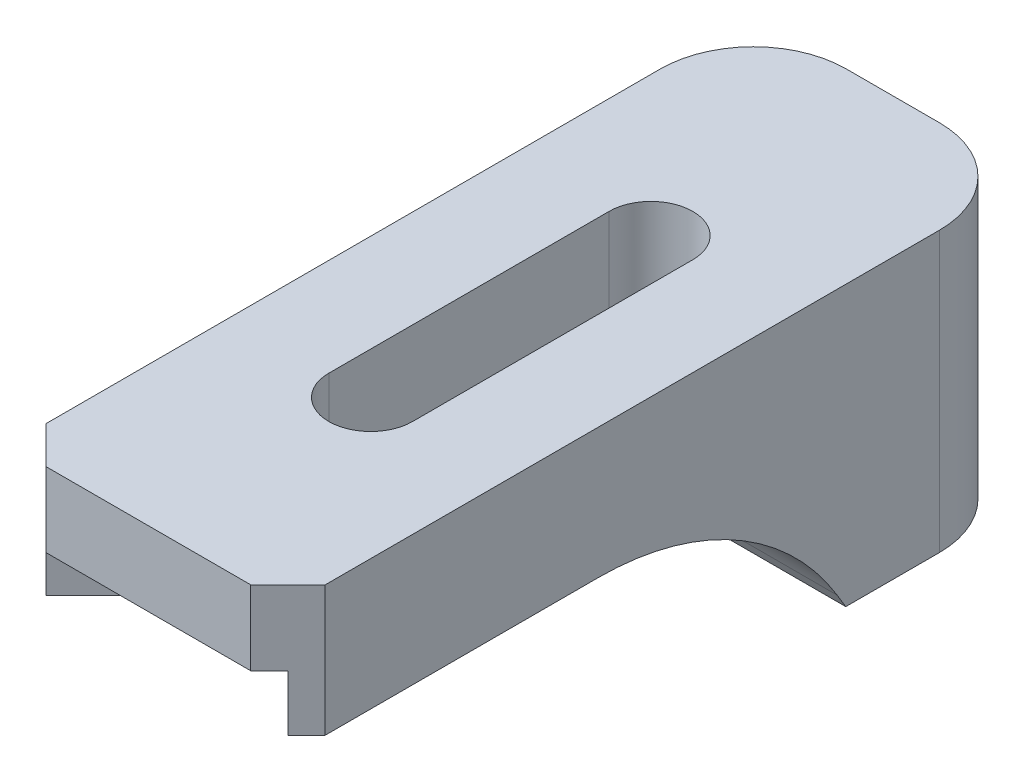
ISO-10303-21;
HEADER;
FILE_DESCRIPTION(('STEP AP214'),'2;1');
FILE_NAME('part.step','',(''),(''),'','','');
FILE_SCHEMA(('AUTOMOTIVE_DESIGN { 1 0 10303 214 1 1 1 1 }'));
ENDSEC;
DATA;
#1=APPLICATION_CONTEXT('core data for automotive mechanical design processes');
#2=APPLICATION_PROTOCOL_DEFINITION('international standard','automotive_design',2000,#1);
#3=PRODUCT_CONTEXT('',#1,'mechanical');
#4=PRODUCT('Part','Part','',(#3));
#5=PRODUCT_RELATED_PRODUCT_CATEGORY('part','',(#4));
#6=PRODUCT_DEFINITION_FORMATION('','',#4);
#7=PRODUCT_DEFINITION_CONTEXT('part definition',#1,'design');
#8=PRODUCT_DEFINITION('design','',#6,#7);
#9=PRODUCT_DEFINITION_SHAPE('','',#8);
#10=(LENGTH_UNIT() NAMED_UNIT(*) SI_UNIT(.MILLI.,.METRE.));
#11=(NAMED_UNIT(*) PLANE_ANGLE_UNIT() SI_UNIT($,.RADIAN.));
#12=(NAMED_UNIT(*) SI_UNIT($,.STERADIAN.) SOLID_ANGLE_UNIT());
#13=UNCERTAINTY_MEASURE_WITH_UNIT(LENGTH_MEASURE(1.E-05),#10,'distance_accuracy_value','');
#14=(GEOMETRIC_REPRESENTATION_CONTEXT(3) GLOBAL_UNCERTAINTY_ASSIGNED_CONTEXT((#13)) GLOBAL_UNIT_ASSIGNED_CONTEXT((#10,
#11,#12)) REPRESENTATION_CONTEXT('',''));
#15=CARTESIAN_POINT('',(0.,0.,0.));
#16=DIRECTION('',(0.,0.,1.));
#17=DIRECTION('',(1.,0.,0.));
#18=AXIS2_PLACEMENT_3D('',#15,#16,#17);
#19=CARTESIAN_POINT('',(-7.5,15.,20.));
#20=DIRECTION('',(0.,0.,-1.));
#21=DIRECTION('',(-1.,0.,0.));
#22=AXIS2_PLACEMENT_3D('',#19,#20,#21);
#23=PLANE('',#22);
#24=DIRECTION('',(1.,0.,0.));
#25=VECTOR('',#24,1.);
#26=CARTESIAN_POINT('',(-7.5,11.,20.));
#27=LINE('',#26,#25);
#28=CARTESIAN_POINT('',(-5.5,11.,20.));
#29=VERTEX_POINT('',#28);
#30=CARTESIAN_POINT('',(5.49999999999999,11.,20.));
#31=VERTEX_POINT('',#30);
#32=EDGE_CURVE('E220',#29,#31,#27,.T.);
#33=ORIENTED_EDGE('',*,*,#32,.T.);
#34=DIRECTION('',(0.,1.,0.));
#35=VECTOR('',#34,1.);
#36=CARTESIAN_POINT('',(5.49999999999999,15.,20.));
#37=LINE('',#36,#35);
#38=CARTESIAN_POINT('',(5.49999999999999,15.,20.));
#39=VERTEX_POINT('',#38);
#40=EDGE_CURVE('E317',#31,#39,#37,.T.);
#41=ORIENTED_EDGE('',*,*,#40,.T.);
#42=DIRECTION('',(1.,0.,0.));
#43=VECTOR('',#42,1.);
#44=CARTESIAN_POINT('',(-7.5,15.,20.));
#45=LINE('',#44,#43);
#46=CARTESIAN_POINT('',(-5.5,15.,20.));
#47=VERTEX_POINT('',#46);
#48=EDGE_CURVE('E261',#47,#39,#45,.T.);
#49=ORIENTED_EDGE('',*,*,#48,.F.);
#50=DIRECTION('',(0.,-1.,0.));
#51=VECTOR('',#50,1.);
#52=CARTESIAN_POINT('',(-5.5,15.,20.));
#53=LINE('',#52,#51);
#54=EDGE_CURVE('E314',#47,#29,#53,.T.);
#55=ORIENTED_EDGE('',*,*,#54,.T.);
#56=EDGE_LOOP('',(#33,#41,#49,#55));
#57=FACE_BOUND('',#56,.T.);
#58=ADVANCED_FACE('F35',(#57),#23,.F.);
#59=CARTESIAN_POINT('',(7.5,8.,20.));
#60=DIRECTION('',(0.,1.,0.));
#61=DIRECTION('',(0.,0.,1.));
#62=AXIS2_PLACEMENT_3D('',#59,#60,#61);
#63=PLANE('',#62);
#64=CARTESIAN_POINT('',(0.,8.,8.05646867848964));
#65=DIRECTION('',(0.,1.,0.));
#66=DIRECTION('',(0.,0.,1.));
#67=AXIS2_PLACEMENT_3D('',#64,#65,#66);
#68=CIRCLE('',#67,2.25);
#69=CARTESIAN_POINT('',(-2.25,8.,8.05646867848964));
#70=VERTEX_POINT('',#69);
#71=CARTESIAN_POINT('',(2.25,8.,8.05646867848964));
#72=VERTEX_POINT('',#71);
#73=EDGE_CURVE('E193',#70,#72,#68,.T.);
#74=ORIENTED_EDGE('',*,*,#73,.T.);
#75=DIRECTION('',(0.,0.,-1.));
#76=VECTOR('',#75,1.);
#77=CARTESIAN_POINT('',(2.25,8.,20.));
#78=LINE('',#77,#76);
#79=CARTESIAN_POINT('',(2.25,8.,3.32900300171792));
#80=VERTEX_POINT('',#79);
#81=EDGE_CURVE('E215',#72,#80,#78,.T.);
#82=ORIENTED_EDGE('',*,*,#81,.T.);
#83=DIRECTION('',(-1.,0.,0.));
#84=VECTOR('',#83,1.);
#85=CARTESIAN_POINT('',(7.5,8.,3.32900300171792));
#86=LINE('',#85,#84);
#87=CARTESIAN_POINT('',(7.5,8.,3.32900300171792));
#88=VERTEX_POINT('',#87);
#89=EDGE_CURVE('E273',#80,#88,#86,.F.);
#90=ORIENTED_EDGE('',*,*,#89,.T.);
#91=DIRECTION('',(0.,0.,-1.));
#92=VECTOR('',#91,1.);
#93=CARTESIAN_POINT('',(7.5,8.,20.));
#94=LINE('',#93,#92);
#95=CARTESIAN_POINT('',(7.5,8.,18.));
#96=VERTEX_POINT('',#95);
#97=EDGE_CURVE('E239',#96,#88,#94,.T.);
#98=ORIENTED_EDGE('',*,*,#97,.F.);
#99=DIRECTION('',(0.707106781186549,0.,-0.707106781186546));
#100=VECTOR('',#99,1.);
#101=CARTESIAN_POINT('',(7.5,8.,18.));
#102=LINE('',#101,#100);
#103=CARTESIAN_POINT('',(6.50000000000001,8.,19.));
#104=VERTEX_POINT('',#103);
#105=EDGE_CURVE('E306',#96,#104,#102,.F.);
#106=ORIENTED_EDGE('',*,*,#105,.T.);
#107=DIRECTION('',(-0.707106781186541,0.,-0.707106781186554));
#108=VECTOR('',#107,1.);
#109=CARTESIAN_POINT('',(7.5,8.,20.));
#110=LINE('',#109,#108);
#111=CARTESIAN_POINT('',(0.972988002638457,8.,13.4729880026383));
#112=VERTEX_POINT('',#111);
#113=EDGE_CURVE('E219',#104,#112,#110,.T.);
#114=ORIENTED_EDGE('',*,*,#113,.T.);
#115=CARTESIAN_POINT('',(1.32654139323173,8.,13.1194346120451));
#116=DIRECTION('',(0.,1.,0.));
#117=DIRECTION('',(0.,0.,1.));
#118=AXIS2_PLACEMENT_3D('',#115,#116,#117);
#119=CIRCLE('',#118,0.5);
#120=CARTESIAN_POINT('',(0.873499825074435,8.,12.9078847656221));
#121=VERTEX_POINT('',#120);
#122=EDGE_CURVE('E287',#112,#121,#119,.F.);
#123=ORIENTED_EDGE('',*,*,#122,.T.);
#124=CARTESIAN_POINT('',(0.,8.,12.4999999999999));
#125=DIRECTION('',(0.,-1.,0.));
#126=DIRECTION('',(0.,0.,-1.));
#127=AXIS2_PLACEMENT_3D('',#124,#125,#126);
#128=CIRCLE('',#127,0.964039380124995);
#129=CARTESIAN_POINT('',(-0.873499825074435,8.,12.9078847656221));
#130=VERTEX_POINT('',#129);
#131=EDGE_CURVE('E234',#130,#121,#128,.T.);
#132=ORIENTED_EDGE('',*,*,#131,.F.);
#133=CARTESIAN_POINT('',(-1.32654139323173,8.,13.1194346120451));
#134=DIRECTION('',(0.,1.,0.));
#135=DIRECTION('',(0.,0.,1.));
#136=AXIS2_PLACEMENT_3D('',#133,#134,#135);
#137=CIRCLE('',#136,0.5);
#138=CARTESIAN_POINT('',(-0.972988002638457,8.,13.4729880026383));
#139=VERTEX_POINT('',#138);
#140=EDGE_CURVE('E285',#130,#139,#137,.F.);
#141=ORIENTED_EDGE('',*,*,#140,.T.);
#142=DIRECTION('',(-0.707106781186541,0.,0.707106781186554));
#143=VECTOR('',#142,1.);
#144=CARTESIAN_POINT('',(-0.681678783017254,8.,13.1816787830171));
#145=LINE('',#144,#143);
#146=CARTESIAN_POINT('',(-6.5,8.,19.));
#147=VERTEX_POINT('',#146);
#148=EDGE_CURVE('E224',#139,#147,#145,.T.);
#149=ORIENTED_EDGE('',*,*,#148,.T.);
#150=DIRECTION('',(0.707106781186546,0.,0.707106781186549));
#151=VECTOR('',#150,1.);
#152=CARTESIAN_POINT('',(-5.49999999999999,8.,20.));
#153=LINE('',#152,#151);
#154=CARTESIAN_POINT('',(-7.5,8.,18.));
#155=VERTEX_POINT('',#154);
#156=EDGE_CURVE('E304',#147,#155,#153,.F.);
#157=ORIENTED_EDGE('',*,*,#156,.T.);
#158=DIRECTION('',(0.,0.,-1.));
#159=VECTOR('',#158,1.);
#160=CARTESIAN_POINT('',(-7.5,8.,20.));
#161=LINE('',#160,#159);
#162=CARTESIAN_POINT('',(-7.5,8.,3.32900300171792));
#163=VERTEX_POINT('',#162);
#164=EDGE_CURVE('E232',#155,#163,#161,.T.);
#165=ORIENTED_EDGE('',*,*,#164,.T.);
#166=CARTESIAN_POINT('',(-2.25,8.,3.32900300171792));
#167=VERTEX_POINT('',#166);
#168=EDGE_CURVE('E274',#163,#167,#86,.F.);
#169=ORIENTED_EDGE('',*,*,#168,.T.);
#170=DIRECTION('',(0.,0.,1.));
#171=VECTOR('',#170,1.);
#172=CARTESIAN_POINT('',(-2.25,8.,20.));
#173=LINE('',#172,#171);
#174=EDGE_CURVE('E58',#167,#70,#173,.T.);
#175=ORIENTED_EDGE('',*,*,#174,.T.);
#176=EDGE_LOOP('',(#74,#82,#90,#98,#106,#114,#123,#132,#141,#149,#157,#165,#169,#175));
#177=FACE_BOUND('',#176,.T.);
#178=ADVANCED_FACE('F386',(#177),#63,.F.);
#179=CARTESIAN_POINT('',(7.5,15.,20.));
#180=DIRECTION('',(-1.,0.,0.));
#181=DIRECTION('',(0.,0.,1.));
#182=AXIS2_PLACEMENT_3D('',#179,#180,#181);
#183=PLANE('',#182);
#184=DIRECTION('',(0.,0.,-1.));
#185=VECTOR('',#184,1.);
#186=CARTESIAN_POINT('',(7.5,0.,20.));
#187=LINE('',#186,#185);
#188=CARTESIAN_POINT('',(7.5,0.,-9.96820088032441));
#189=VERTEX_POINT('',#188);
#190=CARTESIAN_POINT('',(7.5,0.,-15.));
#191=VERTEX_POINT('',#190);
#192=EDGE_CURVE('E251',#189,#191,#187,.T.);
#193=ORIENTED_EDGE('',*,*,#192,.T.);
#194=DIRECTION('',(0.,-1.,0.));
#195=VECTOR('',#194,1.);
#196=CARTESIAN_POINT('',(7.5,15.,-15.));
#197=LINE('',#196,#195);
#198=CARTESIAN_POINT('',(7.5,15.,-15.));
#199=VERTEX_POINT('',#198);
#200=EDGE_CURVE('E337',#191,#199,#197,.F.);
#201=ORIENTED_EDGE('',*,*,#200,.T.);
#202=DIRECTION('',(0.,0.,-1.));
#203=VECTOR('',#202,1.);
#204=CARTESIAN_POINT('',(7.5,15.,20.));
#205=LINE('',#204,#203);
#206=CARTESIAN_POINT('',(7.5,15.,18.));
#207=VERTEX_POINT('',#206);
#208=EDGE_CURVE('E252',#207,#199,#205,.T.);
#209=ORIENTED_EDGE('',*,*,#208,.F.);
#210=DIRECTION('',(0.,-1.,0.));
#211=VECTOR('',#210,1.);
#212=CARTESIAN_POINT('',(7.5,15.,18.));
#213=LINE('',#212,#211);
#214=EDGE_CURVE('E301',#207,#96,#213,.T.);
#215=ORIENTED_EDGE('',*,*,#214,.T.);
#216=ORIENTED_EDGE('',*,*,#97,.T.);
#217=CARTESIAN_POINT('',(7.5,-7.,3.32900300171792));
#218=DIRECTION('',(-1.,0.,0.));
#219=DIRECTION('',(0.,0.,1.));
#220=AXIS2_PLACEMENT_3D('',#217,#218,#219);
#221=CIRCLE('',#220,15.);
#222=CARTESIAN_POINT('',(7.5,0.772425422968107,-9.50023715677935));
#223=VERTEX_POINT('',#222);
#224=EDGE_CURVE('E280',#88,#223,#221,.T.);
#225=ORIENTED_EDGE('',*,*,#224,.T.);
#226=DIRECTION('',(0.,-0.855282677233151,-0.518161694864541));
#227=VECTOR('',#226,1.);
#228=CARTESIAN_POINT('',(7.5,8.,-5.12150671796116));
#229=LINE('',#228,#227);
#230=EDGE_CURVE('E242',#223,#189,#229,.T.);
#231=ORIENTED_EDGE('',*,*,#230,.T.);
#232=EDGE_LOOP('',(#193,#201,#209,#215,#216,#225,#231));
#233=FACE_BOUND('',#232,.T.);
#234=ADVANCED_FACE('F389',(#233),#183,.F.);
#235=CARTESIAN_POINT('',(-7.5,15.,-20.));
#236=DIRECTION('',(0.,0.,1.));
#237=DIRECTION('',(1.,0.,0.));
#238=AXIS2_PLACEMENT_3D('',#235,#236,#237);
#239=PLANE('',#238);
#240=DIRECTION('',(-1.,0.,0.));
#241=VECTOR('',#240,1.);
#242=CARTESIAN_POINT('',(-7.5,15.,-20.));
#243=LINE('',#242,#241);
#244=CARTESIAN_POINT('',(2.5,15.,-20.));
#245=VERTEX_POINT('',#244);
#246=CARTESIAN_POINT('',(-2.5,15.,-20.));
#247=VERTEX_POINT('',#246);
#248=EDGE_CURVE('E255',#245,#247,#243,.T.);
#249=ORIENTED_EDGE('',*,*,#248,.F.);
#250=DIRECTION('',(0.,-1.,0.));
#251=VECTOR('',#250,1.);
#252=CARTESIAN_POINT('',(2.5,15.,-20.));
#253=LINE('',#252,#251);
#254=CARTESIAN_POINT('',(2.5,0.,-20.));
#255=VERTEX_POINT('',#254);
#256=EDGE_CURVE('E330',#245,#255,#253,.T.);
#257=ORIENTED_EDGE('',*,*,#256,.T.);
#258=DIRECTION('',(-1.,0.,0.));
#259=VECTOR('',#258,1.);
#260=CARTESIAN_POINT('',(-7.5,0.,-20.));
#261=LINE('',#260,#259);
#262=CARTESIAN_POINT('',(-2.5,0.,-20.));
#263=VERTEX_POINT('',#262);
#264=EDGE_CURVE('E267',#255,#263,#261,.T.);
#265=ORIENTED_EDGE('',*,*,#264,.T.);
#266=DIRECTION('',(0.,-1.,0.));
#267=VECTOR('',#266,1.);
#268=CARTESIAN_POINT('',(-2.5,15.,-20.));
#269=LINE('',#268,#267);
#270=EDGE_CURVE('E328',#263,#247,#269,.F.);
#271=ORIENTED_EDGE('',*,*,#270,.T.);
#272=EDGE_LOOP('',(#249,#257,#265,#271));
#273=FACE_BOUND('',#272,.T.);
#274=ADVANCED_FACE('F402',(#273),#239,.F.);
#275=CARTESIAN_POINT('',(-7.5,15.,20.));
#276=DIRECTION('',(1.,0.,0.));
#277=DIRECTION('',(0.,0.,-1.));
#278=AXIS2_PLACEMENT_3D('',#275,#276,#277);
#279=PLANE('',#278);
#280=DIRECTION('',(0.,0.,1.));
#281=VECTOR('',#280,1.);
#282=CARTESIAN_POINT('',(-7.5,15.,20.));
#283=LINE('',#282,#281);
#284=CARTESIAN_POINT('',(-7.5,15.,-15.));
#285=VERTEX_POINT('',#284);
#286=CARTESIAN_POINT('',(-7.5,15.,18.));
#287=VERTEX_POINT('',#286);
#288=EDGE_CURVE('E259',#285,#287,#283,.T.);
#289=ORIENTED_EDGE('',*,*,#288,.F.);
#290=DIRECTION('',(0.,-1.,0.));
#291=VECTOR('',#290,1.);
#292=CARTESIAN_POINT('',(-7.5,15.,-15.));
#293=LINE('',#292,#291);
#294=CARTESIAN_POINT('',(-7.5,0.,-15.));
#295=VERTEX_POINT('',#294);
#296=EDGE_CURVE('E343',#285,#295,#293,.T.);
#297=ORIENTED_EDGE('',*,*,#296,.T.);
#298=DIRECTION('',(0.,0.,1.));
#299=VECTOR('',#298,1.);
#300=CARTESIAN_POINT('',(-7.5,0.,20.));
#301=LINE('',#300,#299);
#302=CARTESIAN_POINT('',(-7.5,0.,-9.96820088032441));
#303=VERTEX_POINT('',#302);
#304=EDGE_CURVE('E256',#295,#303,#301,.T.);
#305=ORIENTED_EDGE('',*,*,#304,.T.);
#306=DIRECTION('',(0.,-0.855282677233151,-0.518161694864541));
#307=VECTOR('',#306,1.);
#308=CARTESIAN_POINT('',(-7.5,8.,-5.12150671796116));
#309=LINE('',#308,#307);
#310=CARTESIAN_POINT('',(-7.5,0.772425422968107,-9.50023715677935));
#311=VERTEX_POINT('',#310);
#312=EDGE_CURVE('E243',#311,#303,#309,.T.);
#313=ORIENTED_EDGE('',*,*,#312,.F.);
#314=CARTESIAN_POINT('',(-7.5,-7.,3.32900300171792));
#315=DIRECTION('',(1.,0.,0.));
#316=DIRECTION('',(0.,0.,-1.));
#317=AXIS2_PLACEMENT_3D('',#314,#315,#316);
#318=CIRCLE('',#317,15.);
#319=EDGE_CURVE('E277',#311,#163,#318,.T.);
#320=ORIENTED_EDGE('',*,*,#319,.T.);
#321=ORIENTED_EDGE('',*,*,#164,.F.);
#322=DIRECTION('',(0.,1.,0.));
#323=VECTOR('',#322,1.);
#324=CARTESIAN_POINT('',(-7.5,15.,18.));
#325=LINE('',#324,#323);
#326=EDGE_CURVE('E325',#155,#287,#325,.T.);
#327=ORIENTED_EDGE('',*,*,#326,.T.);
#328=EDGE_LOOP('',(#289,#297,#305,#313,#320,#321,#327));
#329=FACE_BOUND('',#328,.T.);
#330=ADVANCED_FACE('F393',(#329),#279,.F.);
#331=CARTESIAN_POINT('',(0.,15.,0.));
#332=DIRECTION('',(0.,-1.,0.));
#333=DIRECTION('',(0.,0.,-1.));
#334=AXIS2_PLACEMENT_3D('',#331,#332,#333);
#335=PLANE('',#334);
#336=DIRECTION('',(0.,0.,1.));
#337=VECTOR('',#336,1.);
#338=CARTESIAN_POINT('',(-2.25,15.,-7.));
#339=LINE('',#338,#337);
#340=CARTESIAN_POINT('',(-2.25,15.,-7.));
#341=VERTEX_POINT('',#340);
#342=CARTESIAN_POINT('',(-2.25,15.,8.05646867848964));
#343=VERTEX_POINT('',#342);
#344=EDGE_CURVE('E198',#341,#343,#339,.T.);
#345=ORIENTED_EDGE('',*,*,#344,.F.);
#346=CARTESIAN_POINT('',(0.,15.,-7.));
#347=DIRECTION('',(0.,1.,0.));
#348=DIRECTION('',(0.,0.,1.));
#349=AXIS2_PLACEMENT_3D('',#346,#347,#348);
#350=CIRCLE('',#349,2.25);
#351=CARTESIAN_POINT('',(2.25,15.,-7.));
#352=VERTEX_POINT('',#351);
#353=EDGE_CURVE('E50',#352,#341,#350,.T.);
#354=ORIENTED_EDGE('',*,*,#353,.F.);
#355=DIRECTION('',(0.,0.,-1.));
#356=VECTOR('',#355,1.);
#357=CARTESIAN_POINT('',(2.25,15.,8.05646867848964));
#358=LINE('',#357,#356);
#359=CARTESIAN_POINT('',(2.25,15.,8.05646867848964));
#360=VERTEX_POINT('',#359);
#361=EDGE_CURVE('E205',#360,#352,#358,.T.);
#362=ORIENTED_EDGE('',*,*,#361,.F.);
#363=CARTESIAN_POINT('',(0.,15.,8.05646867848964));
#364=DIRECTION('',(0.,1.,0.));
#365=DIRECTION('',(0.,0.,1.));
#366=AXIS2_PLACEMENT_3D('',#363,#364,#365);
#367=CIRCLE('',#366,2.25);
#368=EDGE_CURVE('E190',#343,#360,#367,.T.);
#369=ORIENTED_EDGE('',*,*,#368,.F.);
#370=EDGE_LOOP('',(#345,#354,#362,#369));
#371=FACE_BOUND('',#370,.T.);
#372=ORIENTED_EDGE('',*,*,#208,.T.);
#373=CARTESIAN_POINT('',(2.5,15.,-15.));
#374=DIRECTION('',(0.,-1.,0.));
#375=DIRECTION('',(0.,0.,-1.));
#376=AXIS2_PLACEMENT_3D('',#373,#374,#375);
#377=CIRCLE('',#376,5.);
#378=EDGE_CURVE('E341',#199,#245,#377,.F.);
#379=ORIENTED_EDGE('',*,*,#378,.T.);
#380=ORIENTED_EDGE('',*,*,#248,.T.);
#381=CARTESIAN_POINT('',(-2.5,15.,-15.));
#382=DIRECTION('',(0.,-1.,0.));
#383=DIRECTION('',(0.,0.,-1.));
#384=AXIS2_PLACEMENT_3D('',#381,#382,#383);
#385=CIRCLE('',#384,5.);
#386=EDGE_CURVE('E339',#247,#285,#385,.F.);
#387=ORIENTED_EDGE('',*,*,#386,.T.);
#388=ORIENTED_EDGE('',*,*,#288,.T.);
#389=DIRECTION('',(-0.707106781186546,0.,-0.707106781186549));
#390=VECTOR('',#389,1.);
#391=CARTESIAN_POINT('',(-5.5,15.,20.));
#392=LINE('',#391,#390);
#393=EDGE_CURVE('E319',#287,#47,#392,.F.);
#394=ORIENTED_EDGE('',*,*,#393,.T.);
#395=ORIENTED_EDGE('',*,*,#48,.T.);
#396=DIRECTION('',(-0.707106781186549,0.,0.707106781186546));
#397=VECTOR('',#396,1.);
#398=CARTESIAN_POINT('',(7.5,15.,18.));
#399=LINE('',#398,#397);
#400=EDGE_CURVE('E321',#39,#207,#399,.F.);
#401=ORIENTED_EDGE('',*,*,#400,.T.);
#402=EDGE_LOOP('',(#372,#379,#380,#387,#388,#394,#395,#401));
#403=FACE_BOUND('',#402,.T.);
#404=ADVANCED_FACE('F202',(#371,#403),#335,.F.);
#405=CARTESIAN_POINT('',(0.,0.,0.));
#406=DIRECTION('',(0.,-1.,0.));
#407=DIRECTION('',(0.,0.,-1.));
#408=AXIS2_PLACEMENT_3D('',#405,#406,#407);
#409=PLANE('',#408);
#410=ORIENTED_EDGE('',*,*,#264,.F.);
#411=CARTESIAN_POINT('',(2.5,0.,-15.));
#412=DIRECTION('',(0.,-1.,0.));
#413=DIRECTION('',(0.,0.,-1.));
#414=AXIS2_PLACEMENT_3D('',#411,#412,#413);
#415=CIRCLE('',#414,5.);
#416=EDGE_CURVE('E335',#255,#191,#415,.T.);
#417=ORIENTED_EDGE('',*,*,#416,.T.);
#418=ORIENTED_EDGE('',*,*,#192,.F.);
#419=DIRECTION('',(-1.,0.,0.));
#420=VECTOR('',#419,1.);
#421=CARTESIAN_POINT('',(7.5,0.,-9.96820088032441));
#422=LINE('',#421,#420);
#423=EDGE_CURVE('E245',#189,#303,#422,.T.);
#424=ORIENTED_EDGE('',*,*,#423,.T.);
#425=ORIENTED_EDGE('',*,*,#304,.F.);
#426=CARTESIAN_POINT('',(-2.5,0.,-15.));
#427=DIRECTION('',(0.,-1.,0.));
#428=DIRECTION('',(0.,0.,-1.));
#429=AXIS2_PLACEMENT_3D('',#426,#427,#428);
#430=CIRCLE('',#429,5.);
#431=EDGE_CURVE('E333',#295,#263,#430,.T.);
#432=ORIENTED_EDGE('',*,*,#431,.T.);
#433=EDGE_LOOP('',(#410,#417,#418,#424,#425,#432));
#434=FACE_BOUND('',#433,.T.);
#435=ADVANCED_FACE('F384',(#434),#409,.T.);
#436=CARTESIAN_POINT('',(7.5,8.,-5.12150671796116));
#437=DIRECTION('',(0.,0.518161694864541,-0.855282677233151));
#438=DIRECTION('',(0.,0.855282677233151,0.518161694864541));
#439=AXIS2_PLACEMENT_3D('',#436,#437,#438);
#440=PLANE('',#439);
#441=ORIENTED_EDGE('',*,*,#230,.F.);
#442=DIRECTION('',(-1.,0.,0.));
#443=VECTOR('',#442,1.);
#444=CARTESIAN_POINT('',(-7.5,0.772425422968107,-9.50023715677935));
#445=LINE('',#444,#443);
#446=EDGE_CURVE('E264',#223,#311,#445,.T.);
#447=ORIENTED_EDGE('',*,*,#446,.T.);
#448=ORIENTED_EDGE('',*,*,#312,.T.);
#449=ORIENTED_EDGE('',*,*,#423,.F.);
#450=EDGE_LOOP('',(#441,#447,#448,#449));
#451=FACE_BOUND('',#450,.T.);
#452=ADVANCED_FACE('F381',(#451),#440,.F.);
#453=CARTESIAN_POINT('',(7.5,-7.,3.32900300171792));
#454=DIRECTION('',(1.,0.,0.));
#455=DIRECTION('',(0.,0.,-1.));
#456=AXIS2_PLACEMENT_3D('',#453,#454,#455);
#457=CYLINDRICAL_SURFACE('',#456,15.);
#458=ORIENTED_EDGE('',*,*,#89,.F.);
#459=CARTESIAN_POINT('',(2.25,-7.,3.32900300171792));
#460=DIRECTION('',(1.,0.,0.));
#461=DIRECTION('',(0.,0.,-1.));
#462=AXIS2_PLACEMENT_3D('',#459,#460,#461);
#463=CIRCLE('',#462,15.);
#464=CARTESIAN_POINT('',(2.25,3.87711804617851,-7.));
#465=VERTEX_POINT('',#464);
#466=EDGE_CURVE('E11',#80,#465,#463,.F.);
#467=ORIENTED_EDGE('',*,*,#466,.T.);
#468=CARTESIAN_POINT('',(2.25,3.87711804617851,-7.));
#469=CARTESIAN_POINT('',(2.24997138100754,3.79184323014569,-7.08981955816418));
#470=CARTESIAN_POINT('',(2.24462289722561,3.70547188034882,-7.17852780092563));
#471=CARTESIAN_POINT('',(2.22385524959282,3.5312047366583,-7.35317044906093));
#472=CARTESIAN_POINT('',(2.20843982257323,3.44330952020159,-7.43910587128437));
#473=CARTESIAN_POINT('',(2.16781983756554,3.26534321226832,-7.60891737808036));
#474=CARTESIAN_POINT('',(2.14247925590786,3.17525895090335,-7.69274683120971));
#475=CARTESIAN_POINT('',(2.08237351414777,2.99480360781103,-7.85664630118208));
#476=CARTESIAN_POINT('',(2.04760760588224,2.90443250387774,-7.93671601899282));
#477=CARTESIAN_POINT('',(1.96840991428834,2.7232651885633,-8.09345738115113));
#478=CARTESIAN_POINT('',(1.92388726612326,2.63247341250642,-8.17008832265907));
#479=CARTESIAN_POINT('',(1.82523247776864,2.45222196745135,-8.31870679742484));
#480=CARTESIAN_POINT('',(1.77109638542093,2.36276286278152,-8.39069240429343));
#481=CARTESIAN_POINT('',(1.65315215542454,2.18697558918757,-8.52898603969004));
#482=CARTESIAN_POINT('',(1.58940711775574,2.10063124262674,-8.59532698788465));
#483=CARTESIAN_POINT('',(1.45125197687365,1.93226456231607,-8.72195989472185));
#484=CARTESIAN_POINT('',(1.376856077768,1.85023666822988,-8.7822597306533));
#485=CARTESIAN_POINT('',(1.23089485945456,1.70749611157732,-8.88515989501331));
#486=CARTESIAN_POINT('',(1.16132477405498,1.64563761238657,-8.92897591260643));
#487=CARTESIAN_POINT('',(1.01335132471035,1.52863624961098,-9.01066669719225));
#488=CARTESIAN_POINT('',(0.934940470188233,1.47349916448971,-9.04853635999195));
#489=CARTESIAN_POINT('',(0.767322894499234,1.37251307553087,-9.11707285335634));
#490=CARTESIAN_POINT('',(0.677973250793298,1.32681402356068,-9.14762447372958));
#491=CARTESIAN_POINT('',(0.537308679274174,1.2697775299689,-9.18544098237199));
#492=CARTESIAN_POINT('',(0.489369633173556,1.25269641149026,-9.1967034065617));
#493=CARTESIAN_POINT('',(0.39155695829238,1.22298477168823,-9.21622853733811));
#494=CARTESIAN_POINT('',(0.341684603473705,1.21035137305682,-9.22449318334534));
#495=CARTESIAN_POINT('',(0.222680088799673,1.18658328602309,-9.24001180454765));
#496=CARTESIAN_POINT('',(0.152928093861514,1.17752847948313,-9.24589453850609));
#497=CARTESIAN_POINT('',(0.0126333424892194,1.16958196975824,-9.25105880920866));
#498=CARTESIAN_POINT('',(-0.057909003978583,1.17068522095292,-9.25034362321275));
#499=CARTESIAN_POINT('',(-0.197594256134483,1.1829059858009,-9.24239697581769));
#500=CARTESIAN_POINT('',(-0.266739445734919,1.19400552724373,-9.23517720891791));
#501=CARTESIAN_POINT('',(-0.402089129418506,1.22510177521744,-9.21484170839885));
#502=CARTESIAN_POINT('',(-0.468290864315908,1.24510664391858,-9.20172056576425));
#503=CARTESIAN_POINT('',(-0.624118541782363,1.30255696023773,-9.16376171664398));
#504=CARTESIAN_POINT('',(-0.711695054127506,1.34380185680598,-9.1363136990278));
#505=CARTESIAN_POINT('',(-0.87798973560518,1.43682241915647,-9.07354407553407));
#506=CARTESIAN_POINT('',(-0.956685229486586,1.48862413413382,-9.03820297218281));
#507=CARTESIAN_POINT('',(-1.09085160654178,1.58844970570276,-8.9690240363846));
#508=CARTESIAN_POINT('',(-1.14784515391271,1.63521065803958,-8.93625919979579));
#509=CARTESIAN_POINT('',(-1.25672231125232,1.73215654354826,-8.86743049645309));
#510=CARTESIAN_POINT('',(-1.30860278771181,1.78234354485442,-8.83136463247771));
#511=CARTESIAN_POINT('',(-1.4573229589101,1.93682925026868,-8.71878701302384));
#512=CARTESIAN_POINT('',(-1.54705505816011,2.04490596131291,-8.63799572051404));
#513=CARTESIAN_POINT('',(-1.69035845691186,2.23997175948265,-8.48769609731804));
#514=CARTESIAN_POINT('',(-1.74746075774004,2.32589304716326,-8.42004719430676));
#515=CARTESIAN_POINT('',(-1.85247469414138,2.49960920321353,-8.28003886910799));
#516=CARTESIAN_POINT('',(-1.90038138381258,2.58740505177303,-8.20767693986312));
#517=CARTESIAN_POINT('',(-1.98716560764417,2.76375687714193,-8.05881338698687));
#518=CARTESIAN_POINT('',(-2.02605188341531,2.85231203106127,-7.98231586055029));
#519=CARTESIAN_POINT('',(-2.09485029040586,3.02952030294648,-7.82549089776369));
#520=CARTESIAN_POINT('',(-2.12476119400865,3.11817343265023,-7.74516293924172));
#521=CARTESIAN_POINT('',(-2.18263493584118,3.32027029173217,-7.5575047991514));
#522=CARTESIAN_POINT('',(-2.20758694134502,3.43354300657403,-7.44902954665593));
#523=CARTESIAN_POINT('',(-2.23283971508329,3.6015565416606,-7.28293375279778));
#524=CARTESIAN_POINT('',(-2.23922772519451,3.6571825666705,-7.22707051009282));
#525=CARTESIAN_POINT('',(-2.24780622192361,3.76772456494937,-7.11428905797188));
#526=CARTESIAN_POINT('',(-2.24999512876522,3.82264026326659,-7.05737045964047));
#527=CARTESIAN_POINT('',(-2.25,3.87711804617851,-7.));
#528=B_SPLINE_CURVE_WITH_KNOTS('',3,(#468,#469,#470,#471,#472,#473,#474,#475,#476,#477,#478,
#479,#480,#481,#482,#483,#484,#485,#486,#487,#488,#489,#490,#491,#492,#493,#494,#495,#496,#497,
#498,#499,#500,#501,#502,#503,#504,#505,#506,#507,#508,#509,#510,#511,#512,#513,#514,#515,#516,
#517,#518,#519,#520,#521,#522,#523,#524,#525,#526,#527),.UNSPECIFIED.,.F.,.F.,(4,2,2,2,2,2,2,2,
2,2,2,2,2,2,2,2,2,2,2,2,2,2,2,2,2,2,2,2,2,4),(0.,0.371359877323529,0.742581984821235,
1.11908046315654,1.49560883592447,1.87580532274614,2.25615847454481,2.63411476110333,
3.01157161674927,3.31961774300625,3.62792685920344,3.94081055296194,4.09691263644263,
4.25291354837752,4.46363145309444,4.67424469753049,4.88448003720504,5.09490846591684,
5.39506939998678,5.6959801564769,5.93766997456505,6.17950700132774,6.66394528345463,
7.03365201428675,7.40355703979992,7.77310208161185,8.14269764534793,8.61813503716349,
8.85531163003141,9.09257743540593),.UNSPECIFIED.);
#529=CARTESIAN_POINT('',(-2.25,3.87711804617851,-7.));
#530=VERTEX_POINT('',#529);
#531=EDGE_CURVE('E43',#465,#530,#528,.T.);
#532=ORIENTED_EDGE('',*,*,#531,.T.);
#533=CARTESIAN_POINT('',(-2.25,-7.,3.32900300171792));
#534=DIRECTION('',(-1.,0.,0.));
#535=DIRECTION('',(0.,0.,1.));
#536=AXIS2_PLACEMENT_3D('',#533,#534,#535);
#537=CIRCLE('',#536,15.);
#538=EDGE_CURVE('E346',#530,#167,#537,.F.);
#539=ORIENTED_EDGE('',*,*,#538,.T.);
#540=ORIENTED_EDGE('',*,*,#168,.F.);
#541=ORIENTED_EDGE('',*,*,#319,.F.);
#542=ORIENTED_EDGE('',*,*,#446,.F.);
#543=ORIENTED_EDGE('',*,*,#224,.F.);
#544=EDGE_LOOP('',(#458,#467,#532,#539,#540,#541,#542,#543));
#545=FACE_BOUND('',#544,.T.);
#546=ADVANCED_FACE('F353',(#545),#457,.F.);
#547=CARTESIAN_POINT('',(7.5,11.,20.));
#548=DIRECTION('',(-0.707106781186554,0.,0.707106781186541));
#549=DIRECTION('',(0.707106781186541,0.,0.707106781186554));
#550=AXIS2_PLACEMENT_3D('',#547,#548,#549);
#551=PLANE('',#550);
#552=ORIENTED_EDGE('',*,*,#113,.F.);
#553=DIRECTION('',(0.,-1.,0.));
#554=VECTOR('',#553,1.);
#555=CARTESIAN_POINT('',(6.50000000000001,11.,19.));
#556=LINE('',#555,#554);
#557=CARTESIAN_POINT('',(6.50000000000001,11.,19.));
#558=VERTEX_POINT('',#557);
#559=EDGE_CURVE('E308',#104,#558,#556,.F.);
#560=ORIENTED_EDGE('',*,*,#559,.T.);
#561=DIRECTION('',(-0.707106781186541,0.,-0.707106781186554));
#562=VECTOR('',#561,1.);
#563=CARTESIAN_POINT('',(7.5,11.,20.));
#564=LINE('',#563,#562);
#565=CARTESIAN_POINT('',(0.972988002638457,11.,13.4729880026383));
#566=VERTEX_POINT('',#565);
#567=EDGE_CURVE('E223',#558,#566,#564,.T.);
#568=ORIENTED_EDGE('',*,*,#567,.T.);
#569=DIRECTION('',(0.,1.,0.));
#570=VECTOR('',#569,1.);
#571=CARTESIAN_POINT('',(0.972988002638456,8.,13.4729880026383));
#572=LINE('',#571,#570);
#573=EDGE_CURVE('E282',#566,#112,#572,.F.);
#574=ORIENTED_EDGE('',*,*,#573,.T.);
#575=EDGE_LOOP('',(#552,#560,#568,#574));
#576=FACE_BOUND('',#575,.T.);
#577=ADVANCED_FACE('F376',(#576),#551,.T.);
#578=CARTESIAN_POINT('',(0.,11.,12.4999999999999));
#579=DIRECTION('',(0.,-1.,0.));
#580=DIRECTION('',(0.,0.,-1.));
#581=AXIS2_PLACEMENT_3D('',#578,#579,#580);
#582=CYLINDRICAL_SURFACE('',#581,0.964039380124995);
#583=ORIENTED_EDGE('',*,*,#131,.T.);
#584=DIRECTION('',(0.,-1.,0.));
#585=VECTOR('',#584,1.);
#586=CARTESIAN_POINT('',(0.873499825074435,11.,12.9078847656221));
#587=LINE('',#586,#585);
#588=CARTESIAN_POINT('',(0.873499825074435,11.,12.9078847656221));
#589=VERTEX_POINT('',#588);
#590=EDGE_CURVE('E292',#121,#589,#587,.F.);
#591=ORIENTED_EDGE('',*,*,#590,.T.);
#592=CARTESIAN_POINT('',(0.,11.,12.4999999999999));
#593=DIRECTION('',(0.,-1.,0.));
#594=DIRECTION('',(0.,0.,-1.));
#595=AXIS2_PLACEMENT_3D('',#592,#593,#594);
#596=CIRCLE('',#595,0.964039380124995);
#597=CARTESIAN_POINT('',(-0.873499825074435,11.,12.9078847656221));
#598=VERTEX_POINT('',#597);
#599=EDGE_CURVE('E226',#598,#589,#596,.T.);
#600=ORIENTED_EDGE('',*,*,#599,.F.);
#601=DIRECTION('',(0.,-1.,0.));
#602=VECTOR('',#601,1.);
#603=CARTESIAN_POINT('',(-0.873499825074436,11.,12.9078847656221));
#604=LINE('',#603,#602);
#605=EDGE_CURVE('E289',#598,#130,#604,.T.);
#606=ORIENTED_EDGE('',*,*,#605,.T.);
#607=EDGE_LOOP('',(#583,#591,#600,#606));
#608=FACE_BOUND('',#607,.T.);
#609=ADVANCED_FACE('F372',(#608),#582,.F.);
#610=CARTESIAN_POINT('',(-0.681678783017254,11.,13.1816787830171));
#611=DIRECTION('',(0.707106781186554,0.,0.707106781186541));
#612=DIRECTION('',(0.707106781186541,0.,-0.707106781186554));
#613=AXIS2_PLACEMENT_3D('',#610,#611,#612);
#614=PLANE('',#613);
#615=DIRECTION('',(-0.707106781186541,0.,0.707106781186554));
#616=VECTOR('',#615,1.);
#617=CARTESIAN_POINT('',(-0.681678783017254,11.,13.1816787830171));
#618=LINE('',#617,#616);
#619=CARTESIAN_POINT('',(-0.972988002638457,11.,13.4729880026383));
#620=VERTEX_POINT('',#619);
#621=CARTESIAN_POINT('',(-6.5,11.,19.));
#622=VERTEX_POINT('',#621);
#623=EDGE_CURVE('E229',#620,#622,#618,.T.);
#624=ORIENTED_EDGE('',*,*,#623,.T.);
#625=DIRECTION('',(0.,1.,0.));
#626=VECTOR('',#625,1.);
#627=CARTESIAN_POINT('',(-6.5,11.,19.));
#628=LINE('',#627,#626);
#629=EDGE_CURVE('E323',#622,#147,#628,.F.);
#630=ORIENTED_EDGE('',*,*,#629,.T.);
#631=ORIENTED_EDGE('',*,*,#148,.F.);
#632=DIRECTION('',(0.,1.,0.));
#633=VECTOR('',#632,1.);
#634=CARTESIAN_POINT('',(-0.972988002638457,11.,13.4729880026383));
#635=LINE('',#634,#633);
#636=EDGE_CURVE('E294',#139,#620,#635,.T.);
#637=ORIENTED_EDGE('',*,*,#636,.T.);
#638=EDGE_LOOP('',(#624,#630,#631,#637));
#639=FACE_BOUND('',#638,.T.);
#640=ADVANCED_FACE('F368',(#639),#614,.T.);
#641=CARTESIAN_POINT('',(0.,11.,12.4999999999999));
#642=DIRECTION('',(0.,-1.,0.));
#643=DIRECTION('',(0.,0.,-1.));
#644=AXIS2_PLACEMENT_3D('',#641,#642,#643);
#645=PLANE('',#644);
#646=ORIENTED_EDGE('',*,*,#567,.F.);
#647=DIRECTION('',(0.707106781186549,0.,-0.707106781186546));
#648=VECTOR('',#647,1.);
#649=CARTESIAN_POINT('',(6.50000000000005,11.,18.9999999999999));
#650=LINE('',#649,#648);
#651=EDGE_CURVE('E312',#558,#31,#650,.F.);
#652=ORIENTED_EDGE('',*,*,#651,.T.);
#653=ORIENTED_EDGE('',*,*,#32,.F.);
#654=DIRECTION('',(0.707106781186546,0.,0.707106781186549));
#655=VECTOR('',#654,1.);
#656=CARTESIAN_POINT('',(-6.50000000000008,11.,18.9999999999999));
#657=LINE('',#656,#655);
#658=EDGE_CURVE('E310',#29,#622,#657,.F.);
#659=ORIENTED_EDGE('',*,*,#658,.T.);
#660=ORIENTED_EDGE('',*,*,#623,.F.);
#661=CARTESIAN_POINT('',(-1.32654139323173,11.,13.1194346120451));
#662=DIRECTION('',(0.,-1.,0.));
#663=DIRECTION('',(0.,0.,-1.));
#664=AXIS2_PLACEMENT_3D('',#661,#662,#663);
#665=CIRCLE('',#664,0.5);
#666=EDGE_CURVE('E299',#620,#598,#665,.F.);
#667=ORIENTED_EDGE('',*,*,#666,.T.);
#668=ORIENTED_EDGE('',*,*,#599,.T.);
#669=CARTESIAN_POINT('',(1.32654139323173,11.,13.1194346120451));
#670=DIRECTION('',(0.,-1.,0.));
#671=DIRECTION('',(0.,0.,-1.));
#672=AXIS2_PLACEMENT_3D('',#669,#670,#671);
#673=CIRCLE('',#672,0.5);
#674=EDGE_CURVE('E296',#589,#566,#673,.F.);
#675=ORIENTED_EDGE('',*,*,#674,.T.);
#676=EDGE_LOOP('',(#646,#652,#653,#659,#660,#667,#668,#675));
#677=FACE_BOUND('',#676,.T.);
#678=ADVANCED_FACE('F364',(#677),#645,.T.);
#679=CARTESIAN_POINT('',(1.32654139323173,11.,13.1194346120451));
#680=DIRECTION('',(0.,-1.,0.));
#681=DIRECTION('',(0.,0.,-1.));
#682=AXIS2_PLACEMENT_3D('',#679,#680,#681);
#683=CYLINDRICAL_SURFACE('',#682,0.5);
#684=ORIENTED_EDGE('',*,*,#674,.F.);
#685=ORIENTED_EDGE('',*,*,#590,.F.);
#686=ORIENTED_EDGE('',*,*,#122,.F.);
#687=ORIENTED_EDGE('',*,*,#573,.F.);
#688=EDGE_LOOP('',(#684,#685,#686,#687));
#689=FACE_BOUND('',#688,.T.);
#690=ADVANCED_FACE('F367',(#689),#683,.T.);
#691=CARTESIAN_POINT('',(-1.32654139323173,11.,13.1194346120451));
#692=DIRECTION('',(0.,-1.,0.));
#693=DIRECTION('',(0.,0.,-1.));
#694=AXIS2_PLACEMENT_3D('',#691,#692,#693);
#695=CYLINDRICAL_SURFACE('',#694,0.5);
#696=ORIENTED_EDGE('',*,*,#666,.F.);
#697=ORIENTED_EDGE('',*,*,#636,.F.);
#698=ORIENTED_EDGE('',*,*,#140,.F.);
#699=ORIENTED_EDGE('',*,*,#605,.F.);
#700=EDGE_LOOP('',(#696,#697,#698,#699));
#701=FACE_BOUND('',#700,.T.);
#702=ADVANCED_FACE('F460',(#701),#695,.T.);
#703=CARTESIAN_POINT('',(7.5,15.,18.));
#704=DIRECTION('',(-0.707106781186546,0.,-0.707106781186549));
#705=DIRECTION('',(0.,-1.,0.));
#706=AXIS2_PLACEMENT_3D('',#703,#704,#705);
#707=PLANE('',#706);
#708=ORIENTED_EDGE('',*,*,#400,.F.);
#709=ORIENTED_EDGE('',*,*,#40,.F.);
#710=ORIENTED_EDGE('',*,*,#651,.F.);
#711=ORIENTED_EDGE('',*,*,#559,.F.);
#712=ORIENTED_EDGE('',*,*,#105,.F.);
#713=ORIENTED_EDGE('',*,*,#214,.F.);
#714=EDGE_LOOP('',(#708,#709,#710,#711,#712,#713));
#715=FACE_BOUND('',#714,.T.);
#716=ADVANCED_FACE('F440',(#715),#707,.F.);
#717=CARTESIAN_POINT('',(-5.5,15.,20.));
#718=DIRECTION('',(0.707106781186549,0.,-0.707106781186546));
#719=DIRECTION('',(0.,-1.,0.));
#720=AXIS2_PLACEMENT_3D('',#717,#718,#719);
#721=PLANE('',#720);
#722=ORIENTED_EDGE('',*,*,#393,.F.);
#723=ORIENTED_EDGE('',*,*,#326,.F.);
#724=ORIENTED_EDGE('',*,*,#156,.F.);
#725=ORIENTED_EDGE('',*,*,#629,.F.);
#726=ORIENTED_EDGE('',*,*,#658,.F.);
#727=ORIENTED_EDGE('',*,*,#54,.F.);
#728=EDGE_LOOP('',(#722,#723,#724,#725,#726,#727));
#729=FACE_BOUND('',#728,.T.);
#730=ADVANCED_FACE('F433',(#729),#721,.F.);
#731=CARTESIAN_POINT('',(2.5,15.,-15.));
#732=DIRECTION('',(0.,-1.,0.));
#733=DIRECTION('',(0.,0.,-1.));
#734=AXIS2_PLACEMENT_3D('',#731,#732,#733);
#735=CYLINDRICAL_SURFACE('',#734,5.);
#736=ORIENTED_EDGE('',*,*,#378,.F.);
#737=ORIENTED_EDGE('',*,*,#200,.F.);
#738=ORIENTED_EDGE('',*,*,#416,.F.);
#739=ORIENTED_EDGE('',*,*,#256,.F.);
#740=EDGE_LOOP('',(#736,#737,#738,#739));
#741=FACE_BOUND('',#740,.T.);
#742=ADVANCED_FACE('F417',(#741),#735,.T.);
#743=CARTESIAN_POINT('',(-2.5,15.,-15.));
#744=DIRECTION('',(0.,-1.,0.));
#745=DIRECTION('',(0.,0.,-1.));
#746=AXIS2_PLACEMENT_3D('',#743,#744,#745);
#747=CYLINDRICAL_SURFACE('',#746,5.);
#748=ORIENTED_EDGE('',*,*,#386,.F.);
#749=ORIENTED_EDGE('',*,*,#270,.F.);
#750=ORIENTED_EDGE('',*,*,#431,.F.);
#751=ORIENTED_EDGE('',*,*,#296,.F.);
#752=EDGE_LOOP('',(#748,#749,#750,#751));
#753=FACE_BOUND('',#752,.T.);
#754=ADVANCED_FACE('F37',(#753),#747,.T.);
#755=CARTESIAN_POINT('',(0.,0.,8.05646867848964));
#756=DIRECTION('',(0.,1.,0.));
#757=DIRECTION('',(0.,0.,1.));
#758=AXIS2_PLACEMENT_3D('',#755,#756,#757);
#759=CYLINDRICAL_SURFACE('',#758,2.25);
#760=DIRECTION('',(0.,1.,0.));
#761=VECTOR('',#760,1.);
#762=CARTESIAN_POINT('',(-2.25,0.,8.05646867848964));
#763=LINE('',#762,#761);
#764=EDGE_CURVE('E185',#70,#343,#763,.T.);
#765=ORIENTED_EDGE('',*,*,#764,.T.);
#766=ORIENTED_EDGE('',*,*,#368,.T.);
#767=DIRECTION('',(0.,1.,0.));
#768=VECTOR('',#767,1.);
#769=CARTESIAN_POINT('',(2.25,0.,8.05646867848964));
#770=LINE('',#769,#768);
#771=EDGE_CURVE('E194',#72,#360,#770,.T.);
#772=ORIENTED_EDGE('',*,*,#771,.F.);
#773=ORIENTED_EDGE('',*,*,#73,.F.);
#774=EDGE_LOOP('',(#765,#766,#772,#773));
#775=FACE_BOUND('',#774,.T.);
#776=ADVANCED_FACE('F187',(#775),#759,.F.);
#777=CARTESIAN_POINT('',(0.,0.,-7.));
#778=DIRECTION('',(0.,1.,0.));
#779=DIRECTION('',(0.,0.,1.));
#780=AXIS2_PLACEMENT_3D('',#777,#778,#779);
#781=CYLINDRICAL_SURFACE('',#780,2.25);
#782=DIRECTION('',(0.,1.,0.));
#783=VECTOR('',#782,1.);
#784=CARTESIAN_POINT('',(2.25,0.,-7.));
#785=LINE('',#784,#783);
#786=EDGE_CURVE('E210',#465,#352,#785,.T.);
#787=ORIENTED_EDGE('',*,*,#786,.T.);
#788=ORIENTED_EDGE('',*,*,#353,.T.);
#789=DIRECTION('',(0.,1.,0.));
#790=VECTOR('',#789,1.);
#791=CARTESIAN_POINT('',(-2.25,0.,-7.));
#792=LINE('',#791,#790);
#793=EDGE_CURVE('E195',#530,#341,#792,.T.);
#794=ORIENTED_EDGE('',*,*,#793,.F.);
#795=ORIENTED_EDGE('',*,*,#531,.F.);
#796=EDGE_LOOP('',(#787,#788,#794,#795));
#797=FACE_BOUND('',#796,.T.);
#798=ADVANCED_FACE('F357',(#797),#781,.F.);
#799=CARTESIAN_POINT('',(2.25,0.,8.05646867848964));
#800=DIRECTION('',(1.,0.,0.));
#801=DIRECTION('',(0.,0.,-1.));
#802=AXIS2_PLACEMENT_3D('',#799,#800,#801);
#803=PLANE('',#802);
#804=ORIENTED_EDGE('',*,*,#771,.T.);
#805=ORIENTED_EDGE('',*,*,#361,.T.);
#806=ORIENTED_EDGE('',*,*,#786,.F.);
#807=ORIENTED_EDGE('',*,*,#466,.F.);
#808=ORIENTED_EDGE('',*,*,#81,.F.);
#809=EDGE_LOOP('',(#804,#805,#806,#807,#808));
#810=FACE_BOUND('',#809,.T.);
#811=ADVANCED_FACE('F362',(#810),#803,.F.);
#812=CARTESIAN_POINT('',(-2.25,0.,-7.));
#813=DIRECTION('',(-1.,0.,0.));
#814=DIRECTION('',(0.,0.,1.));
#815=AXIS2_PLACEMENT_3D('',#812,#813,#814);
#816=PLANE('',#815);
#817=ORIENTED_EDGE('',*,*,#538,.F.);
#818=ORIENTED_EDGE('',*,*,#793,.T.);
#819=ORIENTED_EDGE('',*,*,#344,.T.);
#820=ORIENTED_EDGE('',*,*,#764,.F.);
#821=ORIENTED_EDGE('',*,*,#174,.F.);
#822=EDGE_LOOP('',(#817,#818,#819,#820,#821));
#823=FACE_BOUND('',#822,.T.);
#824=ADVANCED_FACE('F199',(#823),#816,.F.);
#825=CLOSED_SHELL('',(#58,#178,#234,#274,#330,#404,#435,#452,#546,#577,#609,#640,#678,#690,#702,
#716,#730,#742,#754,#776,#798,#811,#824));
#826=MANIFOLD_SOLID_BREP('B2',#825);
#827=ADVANCED_BREP_SHAPE_REPRESENTATION('',(#18,#826),#14);
#828=SHAPE_DEFINITION_REPRESENTATION(#9,#827);
ENDSEC;
END-ISO-10303-21;
